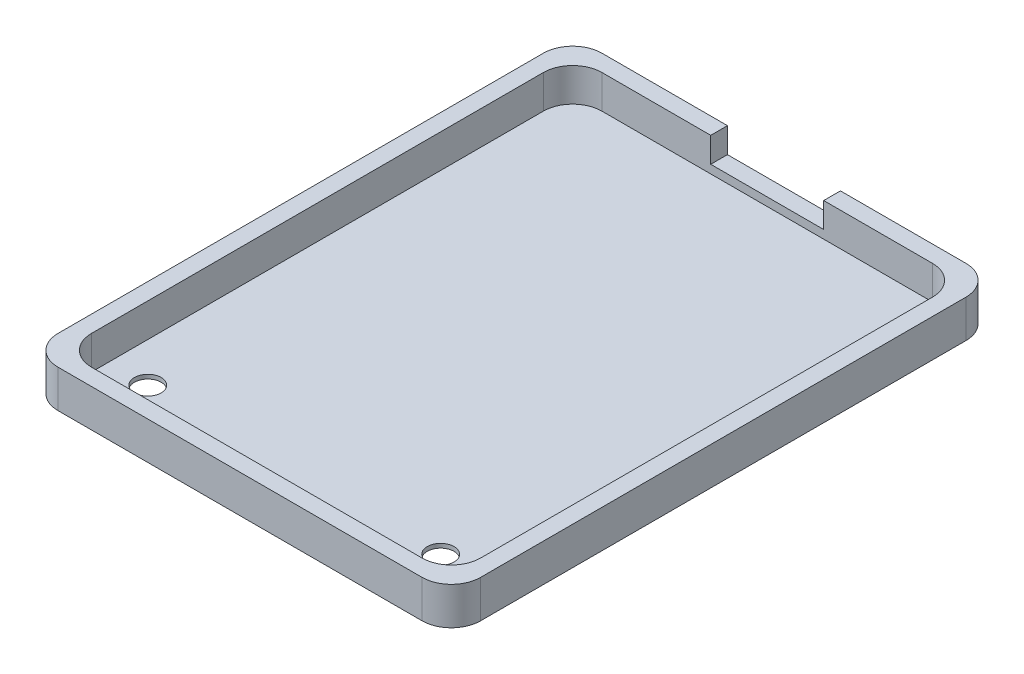
ISO-10303-21;
HEADER;
FILE_DESCRIPTION(('STEP AP214'),'2;1');
FILE_NAME('part.step','',(''),(''),'','','');
FILE_SCHEMA(('AUTOMOTIVE_DESIGN { 1 0 10303 214 1 1 1 1 }'));
ENDSEC;
DATA;
#1=APPLICATION_CONTEXT('core data for automotive mechanical design processes');
#2=APPLICATION_PROTOCOL_DEFINITION('international standard','automotive_design',2000,#1);
#3=PRODUCT_CONTEXT('',#1,'mechanical');
#4=PRODUCT('Part','Part','',(#3));
#5=PRODUCT_RELATED_PRODUCT_CATEGORY('part','',(#4));
#6=PRODUCT_DEFINITION_FORMATION('','',#4);
#7=PRODUCT_DEFINITION_CONTEXT('part definition',#1,'design');
#8=PRODUCT_DEFINITION('design','',#6,#7);
#9=PRODUCT_DEFINITION_SHAPE('','',#8);
#10=(LENGTH_UNIT() NAMED_UNIT(*) SI_UNIT(.MILLI.,.METRE.));
#11=(NAMED_UNIT(*) PLANE_ANGLE_UNIT() SI_UNIT($,.RADIAN.));
#12=(NAMED_UNIT(*) SI_UNIT($,.STERADIAN.) SOLID_ANGLE_UNIT());
#13=UNCERTAINTY_MEASURE_WITH_UNIT(LENGTH_MEASURE(1.E-05),#10,'distance_accuracy_value','');
#14=(GEOMETRIC_REPRESENTATION_CONTEXT(3) GLOBAL_UNCERTAINTY_ASSIGNED_CONTEXT((#13)) GLOBAL_UNIT_ASSIGNED_CONTEXT((#10,
#11,#12)) REPRESENTATION_CONTEXT('',''));
#15=CARTESIAN_POINT('',(0.,0.,0.));
#16=DIRECTION('',(0.,0.,1.));
#17=DIRECTION('',(1.,0.,0.));
#18=AXIS2_PLACEMENT_3D('',#15,#16,#17);
#19=CARTESIAN_POINT('',(47.,4.5,-3.5));
#20=DIRECTION('',(0.,-1.,0.));
#21=DIRECTION('',(0.,0.,-1.));
#22=AXIS2_PLACEMENT_3D('',#19,#20,#21);
#23=CYLINDRICAL_SURFACE('',#22,3.5);
#24=CARTESIAN_POINT('',(47.,0.,-3.5));
#25=DIRECTION('',(0.,1.,0.));
#26=DIRECTION('',(0.,0.,1.));
#27=AXIS2_PLACEMENT_3D('',#24,#25,#26);
#28=CIRCLE('',#27,3.5);
#29=CARTESIAN_POINT('',(47.,0.,0.));
#30=VERTEX_POINT('',#29);
#31=CARTESIAN_POINT('',(50.5,0.,-3.5));
#32=VERTEX_POINT('',#31);
#33=EDGE_CURVE('E246',#30,#32,#28,.T.);
#34=ORIENTED_EDGE('',*,*,#33,.T.);
#35=DIRECTION('',(0.,-1.,0.));
#36=VECTOR('',#35,1.);
#37=CARTESIAN_POINT('',(50.5,4.5,-3.5));
#38=LINE('',#37,#36);
#39=CARTESIAN_POINT('',(50.5,4.5,-3.5));
#40=VERTEX_POINT('',#39);
#41=EDGE_CURVE('E316',#40,#32,#38,.T.);
#42=ORIENTED_EDGE('',*,*,#41,.F.);
#43=CARTESIAN_POINT('',(47.,4.5,-3.5));
#44=DIRECTION('',(0.,1.,0.));
#45=DIRECTION('',(0.,0.,1.));
#46=AXIS2_PLACEMENT_3D('',#43,#44,#45);
#47=CIRCLE('',#46,3.5);
#48=CARTESIAN_POINT('',(47.,4.5,0.));
#49=VERTEX_POINT('',#48);
#50=EDGE_CURVE('E261',#49,#40,#47,.T.);
#51=ORIENTED_EDGE('',*,*,#50,.F.);
#52=DIRECTION('',(0.,-1.,0.));
#53=VECTOR('',#52,1.);
#54=CARTESIAN_POINT('',(47.,4.5,0.));
#55=LINE('',#54,#53);
#56=EDGE_CURVE('E280',#49,#30,#55,.T.);
#57=ORIENTED_EDGE('',*,*,#56,.T.);
#58=EDGE_LOOP('',(#34,#42,#51,#57));
#59=FACE_BOUND('',#58,.T.);
#60=ADVANCED_FACE('F33',(#59),#23,.T.);
#61=CARTESIAN_POINT('',(50.5,4.5,-3.5));
#62=DIRECTION('',(-1.,0.,0.));
#63=DIRECTION('',(0.,0.,1.));
#64=AXIS2_PLACEMENT_3D('',#61,#62,#63);
#65=PLANE('',#64);
#66=DIRECTION('',(0.,0.,-1.));
#67=VECTOR('',#66,1.);
#68=CARTESIAN_POINT('',(50.5,0.,-3.5));
#69=LINE('',#68,#67);
#70=CARTESIAN_POINT('',(50.5,0.,-61.5));
#71=VERTEX_POINT('',#70);
#72=EDGE_CURVE('E283',#32,#71,#69,.T.);
#73=ORIENTED_EDGE('',*,*,#72,.T.);
#74=DIRECTION('',(0.,-1.,0.));
#75=VECTOR('',#74,1.);
#76=CARTESIAN_POINT('',(50.5,4.5,-61.5));
#77=LINE('',#76,#75);
#78=CARTESIAN_POINT('',(50.5,4.5,-61.5));
#79=VERTEX_POINT('',#78);
#80=EDGE_CURVE('E313',#79,#71,#77,.T.);
#81=ORIENTED_EDGE('',*,*,#80,.F.);
#82=DIRECTION('',(0.,0.,-1.));
#83=VECTOR('',#82,1.);
#84=CARTESIAN_POINT('',(50.5,4.5,-3.5));
#85=LINE('',#84,#83);
#86=EDGE_CURVE('E264',#40,#79,#85,.T.);
#87=ORIENTED_EDGE('',*,*,#86,.F.);
#88=ORIENTED_EDGE('',*,*,#41,.T.);
#89=EDGE_LOOP('',(#73,#81,#87,#88));
#90=FACE_BOUND('',#89,.T.);
#91=ADVANCED_FACE('F410',(#90),#65,.F.);
#92=CARTESIAN_POINT('',(47.,4.5,-61.5));
#93=DIRECTION('',(0.,-1.,0.));
#94=DIRECTION('',(0.,0.,-1.));
#95=AXIS2_PLACEMENT_3D('',#92,#93,#94);
#96=CYLINDRICAL_SURFACE('',#95,3.50000000000001);
#97=CARTESIAN_POINT('',(47.,0.,-61.5));
#98=DIRECTION('',(0.,1.,0.));
#99=DIRECTION('',(0.,0.,-1.));
#100=AXIS2_PLACEMENT_3D('',#97,#98,#99);
#101=CIRCLE('',#100,3.50000000000001);
#102=CARTESIAN_POINT('',(47.,0.,-65.));
#103=VERTEX_POINT('',#102);
#104=EDGE_CURVE('E285',#71,#103,#101,.T.);
#105=ORIENTED_EDGE('',*,*,#104,.T.);
#106=DIRECTION('',(0.,-1.,0.));
#107=VECTOR('',#106,1.);
#108=CARTESIAN_POINT('',(47.,4.5,-65.));
#109=LINE('',#108,#107);
#110=CARTESIAN_POINT('',(47.,4.5,-65.));
#111=VERTEX_POINT('',#110);
#112=EDGE_CURVE('E310',#111,#103,#109,.T.);
#113=ORIENTED_EDGE('',*,*,#112,.F.);
#114=CARTESIAN_POINT('',(47.,4.5,-61.5));
#115=DIRECTION('',(0.,1.,0.));
#116=DIRECTION('',(0.,0.,-1.));
#117=AXIS2_PLACEMENT_3D('',#114,#115,#116);
#118=CIRCLE('',#117,3.50000000000001);
#119=EDGE_CURVE('E267',#79,#111,#118,.T.);
#120=ORIENTED_EDGE('',*,*,#119,.F.);
#121=ORIENTED_EDGE('',*,*,#80,.T.);
#122=EDGE_LOOP('',(#105,#113,#120,#121));
#123=FACE_BOUND('',#122,.T.);
#124=ADVANCED_FACE('F415',(#123),#96,.T.);
#125=CARTESIAN_POINT('',(3.50000000000002,4.5,-65.));
#126=DIRECTION('',(0.,0.,1.));
#127=DIRECTION('',(1.,0.,0.));
#128=AXIS2_PLACEMENT_3D('',#125,#126,#127);
#129=PLANE('',#128);
#130=DIRECTION('',(-1.,0.,0.));
#131=VECTOR('',#130,1.);
#132=CARTESIAN_POINT('',(3.50000000000002,4.5,-65.));
#133=LINE('',#132,#131);
#134=CARTESIAN_POINT('',(18.5,4.5,-65.));
#135=VERTEX_POINT('',#134);
#136=CARTESIAN_POINT('',(3.5,4.5,-65.));
#137=VERTEX_POINT('',#136);
#138=EDGE_CURVE('E269',#135,#137,#133,.T.);
#139=ORIENTED_EDGE('',*,*,#138,.F.);
#140=DIRECTION('',(0.,1.,0.));
#141=VECTOR('',#140,1.);
#142=CARTESIAN_POINT('',(18.5,1.5,-65.));
#143=LINE('',#142,#141);
#144=CARTESIAN_POINT('',(18.5,1.5,-65.));
#145=VERTEX_POINT('',#144);
#146=EDGE_CURVE('E185',#145,#135,#143,.T.);
#147=ORIENTED_EDGE('',*,*,#146,.F.);
#148=DIRECTION('',(-1.,0.,0.));
#149=VECTOR('',#148,1.);
#150=CARTESIAN_POINT('',(32.,1.5,-65.));
#151=LINE('',#150,#149);
#152=CARTESIAN_POINT('',(32.,1.5,-65.));
#153=VERTEX_POINT('',#152);
#154=EDGE_CURVE('E171',#153,#145,#151,.T.);
#155=ORIENTED_EDGE('',*,*,#154,.F.);
#156=DIRECTION('',(0.,-1.,0.));
#157=VECTOR('',#156,1.);
#158=CARTESIAN_POINT('',(32.,1.5,-65.));
#159=LINE('',#158,#157);
#160=CARTESIAN_POINT('',(32.,4.5,-65.));
#161=VERTEX_POINT('',#160);
#162=EDGE_CURVE('E178',#161,#153,#159,.T.);
#163=ORIENTED_EDGE('',*,*,#162,.F.);
#164=EDGE_CURVE('E270',#111,#161,#133,.T.);
#165=ORIENTED_EDGE('',*,*,#164,.F.);
#166=ORIENTED_EDGE('',*,*,#112,.T.);
#167=DIRECTION('',(-1.,0.,0.));
#168=VECTOR('',#167,1.);
#169=CARTESIAN_POINT('',(3.50000000000002,0.,-65.));
#170=LINE('',#169,#168);
#171=CARTESIAN_POINT('',(3.5,0.,-65.));
#172=VERTEX_POINT('',#171);
#173=EDGE_CURVE('E287',#103,#172,#170,.T.);
#174=ORIENTED_EDGE('',*,*,#173,.T.);
#175=DIRECTION('',(0.,-1.,0.));
#176=VECTOR('',#175,1.);
#177=CARTESIAN_POINT('',(3.5,4.5,-65.));
#178=LINE('',#177,#176);
#179=EDGE_CURVE('E307',#137,#172,#178,.T.);
#180=ORIENTED_EDGE('',*,*,#179,.F.);
#181=EDGE_LOOP('',(#139,#147,#155,#163,#165,#166,#174,#180));
#182=FACE_BOUND('',#181,.T.);
#183=ADVANCED_FACE('F188',(#182),#129,.F.);
#184=CARTESIAN_POINT('',(3.5,4.5,-61.5));
#185=DIRECTION('',(0.,-1.,0.));
#186=DIRECTION('',(0.,0.,-1.));
#187=AXIS2_PLACEMENT_3D('',#184,#185,#186);
#188=CYLINDRICAL_SURFACE('',#187,3.5);
#189=CARTESIAN_POINT('',(3.5,0.,-61.5));
#190=DIRECTION('',(0.,1.,0.));
#191=DIRECTION('',(0.,0.,-1.));
#192=AXIS2_PLACEMENT_3D('',#189,#190,#191);
#193=CIRCLE('',#192,3.5);
#194=CARTESIAN_POINT('',(0.,0.,-61.5));
#195=VERTEX_POINT('',#194);
#196=EDGE_CURVE('E289',#172,#195,#193,.T.);
#197=ORIENTED_EDGE('',*,*,#196,.T.);
#198=DIRECTION('',(0.,-1.,0.));
#199=VECTOR('',#198,1.);
#200=CARTESIAN_POINT('',(0.,4.5,-61.5));
#201=LINE('',#200,#199);
#202=CARTESIAN_POINT('',(0.,4.5,-61.5));
#203=VERTEX_POINT('',#202);
#204=EDGE_CURVE('E304',#203,#195,#201,.T.);
#205=ORIENTED_EDGE('',*,*,#204,.F.);
#206=CARTESIAN_POINT('',(3.5,4.5,-61.5));
#207=DIRECTION('',(0.,1.,0.));
#208=DIRECTION('',(0.,0.,-1.));
#209=AXIS2_PLACEMENT_3D('',#206,#207,#208);
#210=CIRCLE('',#209,3.5);
#211=EDGE_CURVE('E272',#137,#203,#210,.T.);
#212=ORIENTED_EDGE('',*,*,#211,.F.);
#213=ORIENTED_EDGE('',*,*,#179,.T.);
#214=EDGE_LOOP('',(#197,#205,#212,#213));
#215=FACE_BOUND('',#214,.T.);
#216=ADVANCED_FACE('F342',(#215),#188,.T.);
#217=CARTESIAN_POINT('',(0.,4.5,-3.50000000000002));
#218=DIRECTION('',(1.,0.,0.));
#219=DIRECTION('',(0.,0.,-1.));
#220=AXIS2_PLACEMENT_3D('',#217,#218,#219);
#221=PLANE('',#220);
#222=DIRECTION('',(0.,0.,1.));
#223=VECTOR('',#222,1.);
#224=CARTESIAN_POINT('',(0.,0.,-3.50000000000002));
#225=LINE('',#224,#223);
#226=CARTESIAN_POINT('',(0.,0.,-3.50000000000002));
#227=VERTEX_POINT('',#226);
#228=EDGE_CURVE('E291',#195,#227,#225,.T.);
#229=ORIENTED_EDGE('',*,*,#228,.T.);
#230=DIRECTION('',(0.,-1.,0.));
#231=VECTOR('',#230,1.);
#232=CARTESIAN_POINT('',(0.,4.5,-3.50000000000002));
#233=LINE('',#232,#231);
#234=CARTESIAN_POINT('',(0.,4.5,-3.50000000000002));
#235=VERTEX_POINT('',#234);
#236=EDGE_CURVE('E301',#235,#227,#233,.T.);
#237=ORIENTED_EDGE('',*,*,#236,.F.);
#238=DIRECTION('',(0.,0.,1.));
#239=VECTOR('',#238,1.);
#240=CARTESIAN_POINT('',(0.,4.5,-3.50000000000002));
#241=LINE('',#240,#239);
#242=EDGE_CURVE('E274',#203,#235,#241,.T.);
#243=ORIENTED_EDGE('',*,*,#242,.F.);
#244=ORIENTED_EDGE('',*,*,#204,.T.);
#245=EDGE_LOOP('',(#229,#237,#243,#244));
#246=FACE_BOUND('',#245,.T.);
#247=ADVANCED_FACE('F346',(#246),#221,.F.);
#248=CARTESIAN_POINT('',(3.5,4.5,-3.5));
#249=DIRECTION('',(0.,-1.,0.));
#250=DIRECTION('',(0.,0.,-1.));
#251=AXIS2_PLACEMENT_3D('',#248,#249,#250);
#252=CYLINDRICAL_SURFACE('',#251,3.5);
#253=CARTESIAN_POINT('',(3.5,0.,-3.5));
#254=DIRECTION('',(0.,1.,0.));
#255=DIRECTION('',(0.,0.,-1.));
#256=AXIS2_PLACEMENT_3D('',#253,#254,#255);
#257=CIRCLE('',#256,3.5);
#258=CARTESIAN_POINT('',(3.50000000000002,0.,0.));
#259=VERTEX_POINT('',#258);
#260=EDGE_CURVE('E293',#227,#259,#257,.T.);
#261=ORIENTED_EDGE('',*,*,#260,.T.);
#262=DIRECTION('',(0.,-1.,0.));
#263=VECTOR('',#262,1.);
#264=CARTESIAN_POINT('',(3.50000000000002,4.5,0.));
#265=LINE('',#264,#263);
#266=CARTESIAN_POINT('',(3.50000000000002,4.5,0.));
#267=VERTEX_POINT('',#266);
#268=EDGE_CURVE('E298',#267,#259,#265,.T.);
#269=ORIENTED_EDGE('',*,*,#268,.F.);
#270=CARTESIAN_POINT('',(3.5,4.5,-3.5));
#271=DIRECTION('',(0.,1.,0.));
#272=DIRECTION('',(0.,0.,-1.));
#273=AXIS2_PLACEMENT_3D('',#270,#271,#272);
#274=CIRCLE('',#273,3.5);
#275=EDGE_CURVE('E276',#235,#267,#274,.T.);
#276=ORIENTED_EDGE('',*,*,#275,.F.);
#277=ORIENTED_EDGE('',*,*,#236,.T.);
#278=EDGE_LOOP('',(#261,#269,#276,#277));
#279=FACE_BOUND('',#278,.T.);
#280=ADVANCED_FACE('F426',(#279),#252,.T.);
#281=CARTESIAN_POINT('',(3.50000000000002,4.5,0.));
#282=DIRECTION('',(0.,0.,-1.));
#283=DIRECTION('',(-1.,0.,0.));
#284=AXIS2_PLACEMENT_3D('',#281,#282,#283);
#285=PLANE('',#284);
#286=DIRECTION('',(1.,0.,0.));
#287=VECTOR('',#286,1.);
#288=CARTESIAN_POINT('',(3.50000000000002,0.,0.));
#289=LINE('',#288,#287);
#290=EDGE_CURVE('E265',#259,#30,#289,.T.);
#291=ORIENTED_EDGE('',*,*,#290,.T.);
#292=ORIENTED_EDGE('',*,*,#56,.F.);
#293=DIRECTION('',(1.,0.,0.));
#294=VECTOR('',#293,1.);
#295=CARTESIAN_POINT('',(3.50000000000002,4.5,0.));
#296=LINE('',#295,#294);
#297=EDGE_CURVE('E278',#267,#49,#296,.T.);
#298=ORIENTED_EDGE('',*,*,#297,.F.);
#299=ORIENTED_EDGE('',*,*,#268,.T.);
#300=EDGE_LOOP('',(#291,#292,#298,#299));
#301=FACE_BOUND('',#300,.T.);
#302=ADVANCED_FACE('F424',(#301),#285,.F.);
#303=CARTESIAN_POINT('',(47.,4.5,-3.5));
#304=DIRECTION('',(0.,1.,0.));
#305=DIRECTION('',(0.,0.,1.));
#306=AXIS2_PLACEMENT_3D('',#303,#304,#305);
#307=PLANE('',#306);
#308=DIRECTION('',(0.,0.,1.));
#309=VECTOR('',#308,1.);
#310=CARTESIAN_POINT('',(18.5,4.5,-3.5));
#311=LINE('',#310,#309);
#312=CARTESIAN_POINT('',(18.5,4.5,-63.));
#313=VERTEX_POINT('',#312);
#314=EDGE_CURVE('E194',#135,#313,#311,.T.);
#315=ORIENTED_EDGE('',*,*,#314,.F.);
#316=ORIENTED_EDGE('',*,*,#138,.T.);
#317=ORIENTED_EDGE('',*,*,#211,.T.);
#318=ORIENTED_EDGE('',*,*,#242,.T.);
#319=ORIENTED_EDGE('',*,*,#275,.T.);
#320=ORIENTED_EDGE('',*,*,#297,.T.);
#321=ORIENTED_EDGE('',*,*,#50,.T.);
#322=ORIENTED_EDGE('',*,*,#86,.T.);
#323=ORIENTED_EDGE('',*,*,#119,.T.);
#324=ORIENTED_EDGE('',*,*,#164,.T.);
#325=DIRECTION('',(0.,0.,-1.));
#326=VECTOR('',#325,1.);
#327=CARTESIAN_POINT('',(32.,4.5,-3.5));
#328=LINE('',#327,#326);
#329=CARTESIAN_POINT('',(32.,4.5,-63.));
#330=VERTEX_POINT('',#329);
#331=EDGE_CURVE('E181',#330,#161,#328,.T.);
#332=ORIENTED_EDGE('',*,*,#331,.F.);
#333=DIRECTION('',(-1.,0.,0.));
#334=VECTOR('',#333,1.);
#335=CARTESIAN_POINT('',(5.50000000000002,4.5,-63.));
#336=LINE('',#335,#334);
#337=CARTESIAN_POINT('',(45.,4.5,-63.));
#338=VERTEX_POINT('',#337);
#339=EDGE_CURVE('E236',#338,#330,#336,.T.);
#340=ORIENTED_EDGE('',*,*,#339,.F.);
#341=CARTESIAN_POINT('',(45.,4.5,-59.5));
#342=DIRECTION('',(0.,1.,0.));
#343=DIRECTION('',(0.,0.,-1.));
#344=AXIS2_PLACEMENT_3D('',#341,#342,#343);
#345=CIRCLE('',#344,3.5);
#346=CARTESIAN_POINT('',(48.5,4.5,-59.5));
#347=VERTEX_POINT('',#346);
#348=EDGE_CURVE('E232',#347,#338,#345,.T.);
#349=ORIENTED_EDGE('',*,*,#348,.F.);
#350=DIRECTION('',(0.,0.,-1.));
#351=VECTOR('',#350,1.);
#352=CARTESIAN_POINT('',(48.5,4.5,-5.5));
#353=LINE('',#352,#351);
#354=CARTESIAN_POINT('',(48.5,4.5,-5.5));
#355=VERTEX_POINT('',#354);
#356=EDGE_CURVE('E229',#355,#347,#353,.T.);
#357=ORIENTED_EDGE('',*,*,#356,.F.);
#358=CARTESIAN_POINT('',(45.,4.5,-5.5));
#359=DIRECTION('',(0.,1.,0.));
#360=DIRECTION('',(0.,0.,1.));
#361=AXIS2_PLACEMENT_3D('',#358,#359,#360);
#362=CIRCLE('',#361,3.5);
#363=CARTESIAN_POINT('',(45.,4.5,-2.));
#364=VERTEX_POINT('',#363);
#365=EDGE_CURVE('E226',#364,#355,#362,.T.);
#366=ORIENTED_EDGE('',*,*,#365,.F.);
#367=DIRECTION('',(1.,0.,0.));
#368=VECTOR('',#367,1.);
#369=CARTESIAN_POINT('',(5.50000000000002,4.5,-2.));
#370=LINE('',#369,#368);
#371=CARTESIAN_POINT('',(5.50000000000003,4.5,-2.));
#372=VERTEX_POINT('',#371);
#373=EDGE_CURVE('E223',#372,#364,#370,.T.);
#374=ORIENTED_EDGE('',*,*,#373,.F.);
#375=CARTESIAN_POINT('',(5.5,4.5,-5.5));
#376=DIRECTION('',(0.,1.,0.));
#377=DIRECTION('',(0.,0.,-1.));
#378=AXIS2_PLACEMENT_3D('',#375,#376,#377);
#379=CIRCLE('',#378,3.5);
#380=CARTESIAN_POINT('',(2.,4.5,-5.50000000000002));
#381=VERTEX_POINT('',#380);
#382=EDGE_CURVE('E55',#381,#372,#379,.T.);
#383=ORIENTED_EDGE('',*,*,#382,.F.);
#384=DIRECTION('',(0.,0.,1.));
#385=VECTOR('',#384,1.);
#386=CARTESIAN_POINT('',(2.,4.5,-5.50000000000002));
#387=LINE('',#386,#385);
#388=CARTESIAN_POINT('',(2.,4.5,-59.5));
#389=VERTEX_POINT('',#388);
#390=EDGE_CURVE('E200',#389,#381,#387,.T.);
#391=ORIENTED_EDGE('',*,*,#390,.F.);
#392=CARTESIAN_POINT('',(5.5,4.5,-59.5));
#393=DIRECTION('',(0.,1.,0.));
#394=DIRECTION('',(0.,0.,-1.));
#395=AXIS2_PLACEMENT_3D('',#392,#393,#394);
#396=CIRCLE('',#395,3.5);
#397=CARTESIAN_POINT('',(5.50000000000002,4.5,-63.));
#398=VERTEX_POINT('',#397);
#399=EDGE_CURVE('E239',#398,#389,#396,.T.);
#400=ORIENTED_EDGE('',*,*,#399,.F.);
#401=EDGE_CURVE('E235',#313,#398,#336,.T.);
#402=ORIENTED_EDGE('',*,*,#401,.F.);
#403=EDGE_LOOP('',(#315,#316,#317,#318,#319,#320,#321,#322,#323,#324,#332,#340,#349,#357,#366,
#374,#383,#391,#400,#402));
#404=FACE_BOUND('',#403,.T.);
#405=ADVANCED_FACE('F326',(#404),#307,.T.);
#406=CARTESIAN_POINT('',(47.,0.,-3.5));
#407=DIRECTION('',(0.,1.,0.));
#408=DIRECTION('',(0.,0.,1.));
#409=AXIS2_PLACEMENT_3D('',#406,#407,#408);
#410=PLANE('',#409);
#411=CARTESIAN_POINT('',(6.72457217614805,0.,-7.5));
#412=DIRECTION('',(0.,1.,0.));
#413=DIRECTION('',(0.,0.,1.));
#414=AXIS2_PLACEMENT_3D('',#411,#412,#413);
#415=CIRCLE('',#414,1.6);
#416=CARTESIAN_POINT('',(6.72457217614805,0.,-5.9));
#417=VERTEX_POINT('',#416);
#418=EDGE_CURVE('E353',#417,#417,#415,.T.);
#419=ORIENTED_EDGE('',*,*,#418,.T.);
#420=EDGE_LOOP('',(#419));
#421=FACE_BOUND('',#420,.T.);
#422=CARTESIAN_POINT('',(41.7245721761481,0.,-7.5));
#423=DIRECTION('',(0.,1.,0.));
#424=DIRECTION('',(0.,0.,1.));
#425=AXIS2_PLACEMENT_3D('',#422,#423,#424);
#426=CIRCLE('',#425,1.6);
#427=CARTESIAN_POINT('',(41.7245721761481,0.,-5.9));
#428=VERTEX_POINT('',#427);
#429=EDGE_CURVE('E355',#428,#428,#426,.T.);
#430=ORIENTED_EDGE('',*,*,#429,.T.);
#431=EDGE_LOOP('',(#430));
#432=FACE_BOUND('',#431,.T.);
#433=ORIENTED_EDGE('',*,*,#33,.F.);
#434=ORIENTED_EDGE('',*,*,#290,.F.);
#435=ORIENTED_EDGE('',*,*,#260,.F.);
#436=ORIENTED_EDGE('',*,*,#228,.F.);
#437=ORIENTED_EDGE('',*,*,#196,.F.);
#438=ORIENTED_EDGE('',*,*,#173,.F.);
#439=ORIENTED_EDGE('',*,*,#104,.F.);
#440=ORIENTED_EDGE('',*,*,#72,.F.);
#441=EDGE_LOOP('',(#433,#434,#435,#436,#437,#438,#439,#440));
#442=FACE_BOUND('',#441,.T.);
#443=ADVANCED_FACE('F337',(#421,#432,#442),#410,.F.);
#444=CARTESIAN_POINT('',(5.5,0.5,-5.5));
#445=DIRECTION('',(0.,1.,0.));
#446=DIRECTION('',(0.,0.,1.));
#447=AXIS2_PLACEMENT_3D('',#444,#445,#446);
#448=CYLINDRICAL_SURFACE('',#447,3.5);
#449=ORIENTED_EDGE('',*,*,#382,.T.);
#450=DIRECTION('',(0.,1.,0.));
#451=VECTOR('',#450,1.);
#452=CARTESIAN_POINT('',(5.50000000000002,0.5,-2.));
#453=LINE('',#452,#451);
#454=CARTESIAN_POINT('',(5.50000000000002,0.5,-2.));
#455=VERTEX_POINT('',#454);
#456=EDGE_CURVE('E221',#455,#372,#453,.T.);
#457=ORIENTED_EDGE('',*,*,#456,.F.);
#458=CARTESIAN_POINT('',(5.5,0.5,-5.5));
#459=DIRECTION('',(0.,1.,0.));
#460=DIRECTION('',(0.,0.,-1.));
#461=AXIS2_PLACEMENT_3D('',#458,#459,#460);
#462=CIRCLE('',#461,3.5);
#463=CARTESIAN_POINT('',(2.,0.5,-5.50000000000002));
#464=VERTEX_POINT('',#463);
#465=EDGE_CURVE('E196',#464,#455,#462,.T.);
#466=ORIENTED_EDGE('',*,*,#465,.F.);
#467=DIRECTION('',(0.,1.,0.));
#468=VECTOR('',#467,1.);
#469=CARTESIAN_POINT('',(2.,0.5,-5.50000000000002));
#470=LINE('',#469,#468);
#471=EDGE_CURVE('E244',#464,#381,#470,.T.);
#472=ORIENTED_EDGE('',*,*,#471,.T.);
#473=EDGE_LOOP('',(#449,#457,#466,#472));
#474=FACE_BOUND('',#473,.T.);
#475=ADVANCED_FACE('F380',(#474),#448,.F.);
#476=CARTESIAN_POINT('',(2.,0.5,-5.50000000000002));
#477=DIRECTION('',(-1.,0.,0.));
#478=DIRECTION('',(0.,0.,1.));
#479=AXIS2_PLACEMENT_3D('',#476,#477,#478);
#480=PLANE('',#479);
#481=ORIENTED_EDGE('',*,*,#390,.T.);
#482=ORIENTED_EDGE('',*,*,#471,.F.);
#483=DIRECTION('',(0.,0.,1.));
#484=VECTOR('',#483,1.);
#485=CARTESIAN_POINT('',(2.,0.5,-5.50000000000002));
#486=LINE('',#485,#484);
#487=CARTESIAN_POINT('',(2.,0.5,-59.5));
#488=VERTEX_POINT('',#487);
#489=EDGE_CURVE('E218',#488,#464,#486,.T.);
#490=ORIENTED_EDGE('',*,*,#489,.F.);
#491=DIRECTION('',(0.,1.,0.));
#492=VECTOR('',#491,1.);
#493=CARTESIAN_POINT('',(2.,0.5,-59.5));
#494=LINE('',#493,#492);
#495=EDGE_CURVE('E247',#488,#389,#494,.T.);
#496=ORIENTED_EDGE('',*,*,#495,.T.);
#497=EDGE_LOOP('',(#481,#482,#490,#496));
#498=FACE_BOUND('',#497,.T.);
#499=ADVANCED_FACE('F398',(#498),#480,.F.);
#500=CARTESIAN_POINT('',(5.5,0.5,-59.5));
#501=DIRECTION('',(0.,1.,0.));
#502=DIRECTION('',(0.,0.,1.));
#503=AXIS2_PLACEMENT_3D('',#500,#501,#502);
#504=CYLINDRICAL_SURFACE('',#503,3.5);
#505=ORIENTED_EDGE('',*,*,#399,.T.);
#506=ORIENTED_EDGE('',*,*,#495,.F.);
#507=CARTESIAN_POINT('',(5.5,0.5,-59.5));
#508=DIRECTION('',(0.,1.,0.));
#509=DIRECTION('',(0.,0.,-1.));
#510=AXIS2_PLACEMENT_3D('',#507,#508,#509);
#511=CIRCLE('',#510,3.5);
#512=CARTESIAN_POINT('',(5.50000000000002,0.5,-63.));
#513=VERTEX_POINT('',#512);
#514=EDGE_CURVE('E215',#513,#488,#511,.T.);
#515=ORIENTED_EDGE('',*,*,#514,.F.);
#516=DIRECTION('',(0.,1.,0.));
#517=VECTOR('',#516,1.);
#518=CARTESIAN_POINT('',(5.50000000000002,0.5,-63.));
#519=LINE('',#518,#517);
#520=EDGE_CURVE('E249',#513,#398,#519,.T.);
#521=ORIENTED_EDGE('',*,*,#520,.T.);
#522=EDGE_LOOP('',(#505,#506,#515,#521));
#523=FACE_BOUND('',#522,.T.);
#524=ADVANCED_FACE('F400',(#523),#504,.F.);
#525=CARTESIAN_POINT('',(5.50000000000002,0.5,-63.));
#526=DIRECTION('',(0.,0.,-1.));
#527=DIRECTION('',(-1.,0.,0.));
#528=AXIS2_PLACEMENT_3D('',#525,#526,#527);
#529=PLANE('',#528);
#530=DIRECTION('',(-1.,0.,0.));
#531=VECTOR('',#530,1.);
#532=CARTESIAN_POINT('',(5.50000000000002,1.5,-63.));
#533=LINE('',#532,#531);
#534=CARTESIAN_POINT('',(32.,1.5,-63.));
#535=VERTEX_POINT('',#534);
#536=CARTESIAN_POINT('',(18.5,1.5,-63.));
#537=VERTEX_POINT('',#536);
#538=EDGE_CURVE('E40',#535,#537,#533,.T.);
#539=ORIENTED_EDGE('',*,*,#538,.T.);
#540=DIRECTION('',(0.,1.,0.));
#541=VECTOR('',#540,1.);
#542=CARTESIAN_POINT('',(18.5,0.5,-63.));
#543=LINE('',#542,#541);
#544=EDGE_CURVE('E11',#537,#313,#543,.T.);
#545=ORIENTED_EDGE('',*,*,#544,.T.);
#546=ORIENTED_EDGE('',*,*,#401,.T.);
#547=ORIENTED_EDGE('',*,*,#520,.F.);
#548=DIRECTION('',(-1.,0.,0.));
#549=VECTOR('',#548,1.);
#550=CARTESIAN_POINT('',(5.50000000000002,0.5,-63.));
#551=LINE('',#550,#549);
#552=CARTESIAN_POINT('',(45.,0.5,-63.));
#553=VERTEX_POINT('',#552);
#554=EDGE_CURVE('E212',#553,#513,#551,.T.);
#555=ORIENTED_EDGE('',*,*,#554,.F.);
#556=DIRECTION('',(0.,1.,0.));
#557=VECTOR('',#556,1.);
#558=CARTESIAN_POINT('',(45.,0.5,-63.));
#559=LINE('',#558,#557);
#560=EDGE_CURVE('E252',#553,#338,#559,.T.);
#561=ORIENTED_EDGE('',*,*,#560,.T.);
#562=ORIENTED_EDGE('',*,*,#339,.T.);
#563=DIRECTION('',(0.,-1.,0.));
#564=VECTOR('',#563,1.);
#565=CARTESIAN_POINT('',(32.,0.5,-63.));
#566=LINE('',#565,#564);
#567=EDGE_CURVE('E319',#330,#535,#566,.T.);
#568=ORIENTED_EDGE('',*,*,#567,.T.);
#569=EDGE_LOOP('',(#539,#545,#546,#547,#555,#561,#562,#568));
#570=FACE_BOUND('',#569,.T.);
#571=ADVANCED_FACE('F321',(#570),#529,.F.);
#572=CARTESIAN_POINT('',(45.,0.5,-59.5));
#573=DIRECTION('',(0.,1.,0.));
#574=DIRECTION('',(0.,0.,1.));
#575=AXIS2_PLACEMENT_3D('',#572,#573,#574);
#576=CYLINDRICAL_SURFACE('',#575,3.5);
#577=ORIENTED_EDGE('',*,*,#348,.T.);
#578=ORIENTED_EDGE('',*,*,#560,.F.);
#579=CARTESIAN_POINT('',(45.,0.5,-59.5));
#580=DIRECTION('',(0.,1.,0.));
#581=DIRECTION('',(0.,0.,-1.));
#582=AXIS2_PLACEMENT_3D('',#579,#580,#581);
#583=CIRCLE('',#582,3.5);
#584=CARTESIAN_POINT('',(48.5,0.5,-59.5));
#585=VERTEX_POINT('',#584);
#586=EDGE_CURVE('E209',#585,#553,#583,.T.);
#587=ORIENTED_EDGE('',*,*,#586,.F.);
#588=DIRECTION('',(0.,1.,0.));
#589=VECTOR('',#588,1.);
#590=CARTESIAN_POINT('',(48.5,0.5,-59.5));
#591=LINE('',#590,#589);
#592=EDGE_CURVE('E254',#585,#347,#591,.T.);
#593=ORIENTED_EDGE('',*,*,#592,.T.);
#594=EDGE_LOOP('',(#577,#578,#587,#593));
#595=FACE_BOUND('',#594,.T.);
#596=ADVANCED_FACE('F393',(#595),#576,.F.);
#597=CARTESIAN_POINT('',(48.5,0.5,-5.5));
#598=DIRECTION('',(1.,0.,0.));
#599=DIRECTION('',(0.,0.,-1.));
#600=AXIS2_PLACEMENT_3D('',#597,#598,#599);
#601=PLANE('',#600);
#602=ORIENTED_EDGE('',*,*,#356,.T.);
#603=ORIENTED_EDGE('',*,*,#592,.F.);
#604=DIRECTION('',(0.,0.,-1.));
#605=VECTOR('',#604,1.);
#606=CARTESIAN_POINT('',(48.5,0.5,-5.5));
#607=LINE('',#606,#605);
#608=CARTESIAN_POINT('',(48.5,0.5,-5.5));
#609=VERTEX_POINT('',#608);
#610=EDGE_CURVE('E206',#609,#585,#607,.T.);
#611=ORIENTED_EDGE('',*,*,#610,.F.);
#612=DIRECTION('',(0.,1.,0.));
#613=VECTOR('',#612,1.);
#614=CARTESIAN_POINT('',(48.5,0.5,-5.5));
#615=LINE('',#614,#613);
#616=EDGE_CURVE('E256',#609,#355,#615,.T.);
#617=ORIENTED_EDGE('',*,*,#616,.T.);
#618=EDGE_LOOP('',(#602,#603,#611,#617));
#619=FACE_BOUND('',#618,.T.);
#620=ADVANCED_FACE('F390',(#619),#601,.F.);
#621=CARTESIAN_POINT('',(45.,0.5,-5.5));
#622=DIRECTION('',(0.,1.,0.));
#623=DIRECTION('',(0.,0.,1.));
#624=AXIS2_PLACEMENT_3D('',#621,#622,#623);
#625=CYLINDRICAL_SURFACE('',#624,3.5);
#626=ORIENTED_EDGE('',*,*,#365,.T.);
#627=ORIENTED_EDGE('',*,*,#616,.F.);
#628=CARTESIAN_POINT('',(45.,0.5,-5.5));
#629=DIRECTION('',(0.,1.,0.));
#630=DIRECTION('',(0.,0.,1.));
#631=AXIS2_PLACEMENT_3D('',#628,#629,#630);
#632=CIRCLE('',#631,3.5);
#633=CARTESIAN_POINT('',(45.,0.5,-2.));
#634=VERTEX_POINT('',#633);
#635=EDGE_CURVE('E203',#634,#609,#632,.T.);
#636=ORIENTED_EDGE('',*,*,#635,.F.);
#637=DIRECTION('',(0.,1.,0.));
#638=VECTOR('',#637,1.);
#639=CARTESIAN_POINT('',(45.,0.5,-2.));
#640=LINE('',#639,#638);
#641=EDGE_CURVE('E258',#634,#364,#640,.T.);
#642=ORIENTED_EDGE('',*,*,#641,.T.);
#643=EDGE_LOOP('',(#626,#627,#636,#642));
#644=FACE_BOUND('',#643,.T.);
#645=ADVANCED_FACE('F386',(#644),#625,.F.);
#646=CARTESIAN_POINT('',(5.50000000000002,0.5,-2.));
#647=DIRECTION('',(0.,0.,1.));
#648=DIRECTION('',(1.,0.,0.));
#649=AXIS2_PLACEMENT_3D('',#646,#647,#648);
#650=PLANE('',#649);
#651=ORIENTED_EDGE('',*,*,#373,.T.);
#652=ORIENTED_EDGE('',*,*,#641,.F.);
#653=DIRECTION('',(1.,0.,0.));
#654=VECTOR('',#653,1.);
#655=CARTESIAN_POINT('',(5.50000000000002,0.5,-2.));
#656=LINE('',#655,#654);
#657=EDGE_CURVE('E199',#455,#634,#656,.T.);
#658=ORIENTED_EDGE('',*,*,#657,.F.);
#659=ORIENTED_EDGE('',*,*,#456,.T.);
#660=EDGE_LOOP('',(#651,#652,#658,#659));
#661=FACE_BOUND('',#660,.T.);
#662=ADVANCED_FACE('F373',(#661),#650,.F.);
#663=CARTESIAN_POINT('',(5.5,0.5,-5.5));
#664=DIRECTION('',(0.,-1.,0.));
#665=DIRECTION('',(0.,0.,-1.));
#666=AXIS2_PLACEMENT_3D('',#663,#664,#665);
#667=PLANE('',#666);
#668=CARTESIAN_POINT('',(6.72457217614805,0.5,-7.5));
#669=DIRECTION('',(0.,1.,0.));
#670=DIRECTION('',(0.,0.,1.));
#671=AXIS2_PLACEMENT_3D('',#668,#669,#670);
#672=CIRCLE('',#671,1.6);
#673=CARTESIAN_POINT('',(6.72457217614805,0.5,-5.9));
#674=VERTEX_POINT('',#673);
#675=EDGE_CURVE('E360',#674,#674,#672,.T.);
#676=ORIENTED_EDGE('',*,*,#675,.F.);
#677=EDGE_LOOP('',(#676));
#678=FACE_BOUND('',#677,.T.);
#679=CARTESIAN_POINT('',(41.7245721761481,0.5,-7.5));
#680=DIRECTION('',(0.,1.,0.));
#681=DIRECTION('',(0.,0.,1.));
#682=AXIS2_PLACEMENT_3D('',#679,#680,#681);
#683=CIRCLE('',#682,1.6);
#684=CARTESIAN_POINT('',(41.7245721761481,0.5,-5.9));
#685=VERTEX_POINT('',#684);
#686=EDGE_CURVE('E361',#685,#685,#683,.T.);
#687=ORIENTED_EDGE('',*,*,#686,.F.);
#688=EDGE_LOOP('',(#687));
#689=FACE_BOUND('',#688,.T.);
#690=ORIENTED_EDGE('',*,*,#465,.T.);
#691=ORIENTED_EDGE('',*,*,#657,.T.);
#692=ORIENTED_EDGE('',*,*,#635,.T.);
#693=ORIENTED_EDGE('',*,*,#610,.T.);
#694=ORIENTED_EDGE('',*,*,#586,.T.);
#695=ORIENTED_EDGE('',*,*,#554,.T.);
#696=ORIENTED_EDGE('',*,*,#514,.T.);
#697=ORIENTED_EDGE('',*,*,#489,.T.);
#698=EDGE_LOOP('',(#690,#691,#692,#693,#694,#695,#696,#697));
#699=FACE_BOUND('',#698,.T.);
#700=ADVANCED_FACE('F370',(#678,#689,#699),#667,.F.);
#701=CARTESIAN_POINT('',(32.,1.5,-50.));
#702=DIRECTION('',(0.,-1.,0.));
#703=DIRECTION('',(0.,0.,-1.));
#704=AXIS2_PLACEMENT_3D('',#701,#702,#703);
#705=PLANE('',#704);
#706=DIRECTION('',(0.,0.,-1.));
#707=VECTOR('',#706,1.);
#708=CARTESIAN_POINT('',(32.,1.5,-50.));
#709=LINE('',#708,#707);
#710=EDGE_CURVE('E47',#535,#153,#709,.T.);
#711=ORIENTED_EDGE('',*,*,#710,.T.);
#712=ORIENTED_EDGE('',*,*,#154,.T.);
#713=DIRECTION('',(0.,0.,-1.));
#714=VECTOR('',#713,1.);
#715=CARTESIAN_POINT('',(18.5,1.5,-50.));
#716=LINE('',#715,#714);
#717=EDGE_CURVE('E175',#537,#145,#716,.T.);
#718=ORIENTED_EDGE('',*,*,#717,.F.);
#719=ORIENTED_EDGE('',*,*,#538,.F.);
#720=EDGE_LOOP('',(#711,#712,#718,#719));
#721=FACE_BOUND('',#720,.T.);
#722=ADVANCED_FACE('F168',(#721),#705,.F.);
#723=CARTESIAN_POINT('',(18.5,1.5,-50.));
#724=DIRECTION('',(-1.,0.,0.));
#725=DIRECTION('',(0.,0.,1.));
#726=AXIS2_PLACEMENT_3D('',#723,#724,#725);
#727=PLANE('',#726);
#728=ORIENTED_EDGE('',*,*,#314,.T.);
#729=ORIENTED_EDGE('',*,*,#544,.F.);
#730=ORIENTED_EDGE('',*,*,#717,.T.);
#731=ORIENTED_EDGE('',*,*,#146,.T.);
#732=EDGE_LOOP('',(#728,#729,#730,#731));
#733=FACE_BOUND('',#732,.T.);
#734=ADVANCED_FACE('F352',(#733),#727,.F.);
#735=CARTESIAN_POINT('',(32.,1.5,-50.));
#736=DIRECTION('',(1.,0.,0.));
#737=DIRECTION('',(0.,0.,-1.));
#738=AXIS2_PLACEMENT_3D('',#735,#736,#737);
#739=PLANE('',#738);
#740=ORIENTED_EDGE('',*,*,#331,.T.);
#741=ORIENTED_EDGE('',*,*,#162,.T.);
#742=ORIENTED_EDGE('',*,*,#710,.F.);
#743=ORIENTED_EDGE('',*,*,#567,.F.);
#744=EDGE_LOOP('',(#740,#741,#742,#743));
#745=FACE_BOUND('',#744,.T.);
#746=ADVANCED_FACE('F179',(#745),#739,.F.);
#747=CARTESIAN_POINT('',(41.7245721761481,-39.5,-7.5));
#748=DIRECTION('',(0.,1.,0.));
#749=DIRECTION('',(0.,0.,1.));
#750=AXIS2_PLACEMENT_3D('',#747,#748,#749);
#751=CYLINDRICAL_SURFACE('',#750,1.6);
#752=ORIENTED_EDGE('',*,*,#686,.T.);
#753=EDGE_LOOP('',(#752));
#754=FACE_BOUND('',#753,.T.);
#755=ORIENTED_EDGE('',*,*,#429,.F.);
#756=EDGE_LOOP('',(#755));
#757=FACE_BOUND('',#756,.T.);
#758=ADVANCED_FACE('F553',(#754,#757),#751,.F.);
#759=CARTESIAN_POINT('',(6.72457217614805,-39.5,-7.5));
#760=DIRECTION('',(0.,1.,0.));
#761=DIRECTION('',(0.,0.,1.));
#762=AXIS2_PLACEMENT_3D('',#759,#760,#761);
#763=CYLINDRICAL_SURFACE('',#762,1.6);
#764=ORIENTED_EDGE('',*,*,#675,.T.);
#765=EDGE_LOOP('',(#764));
#766=FACE_BOUND('',#765,.T.);
#767=ORIENTED_EDGE('',*,*,#418,.F.);
#768=EDGE_LOOP('',(#767));
#769=FACE_BOUND('',#768,.T.);
#770=ADVANCED_FACE('F367',(#766,#769),#763,.F.);
#771=CLOSED_SHELL('',(#60,#91,#124,#183,#216,#247,#280,#302,#405,#443,#475,#499,#524,#571,#596,
#620,#645,#662,#700,#722,#734,#746,#758,#770));
#772=MANIFOLD_SOLID_BREP('B2',#771);
#773=ADVANCED_BREP_SHAPE_REPRESENTATION('',(#18,#772),#14);
#774=SHAPE_DEFINITION_REPRESENTATION(#9,#773);
ENDSEC;
END-ISO-10303-21;
